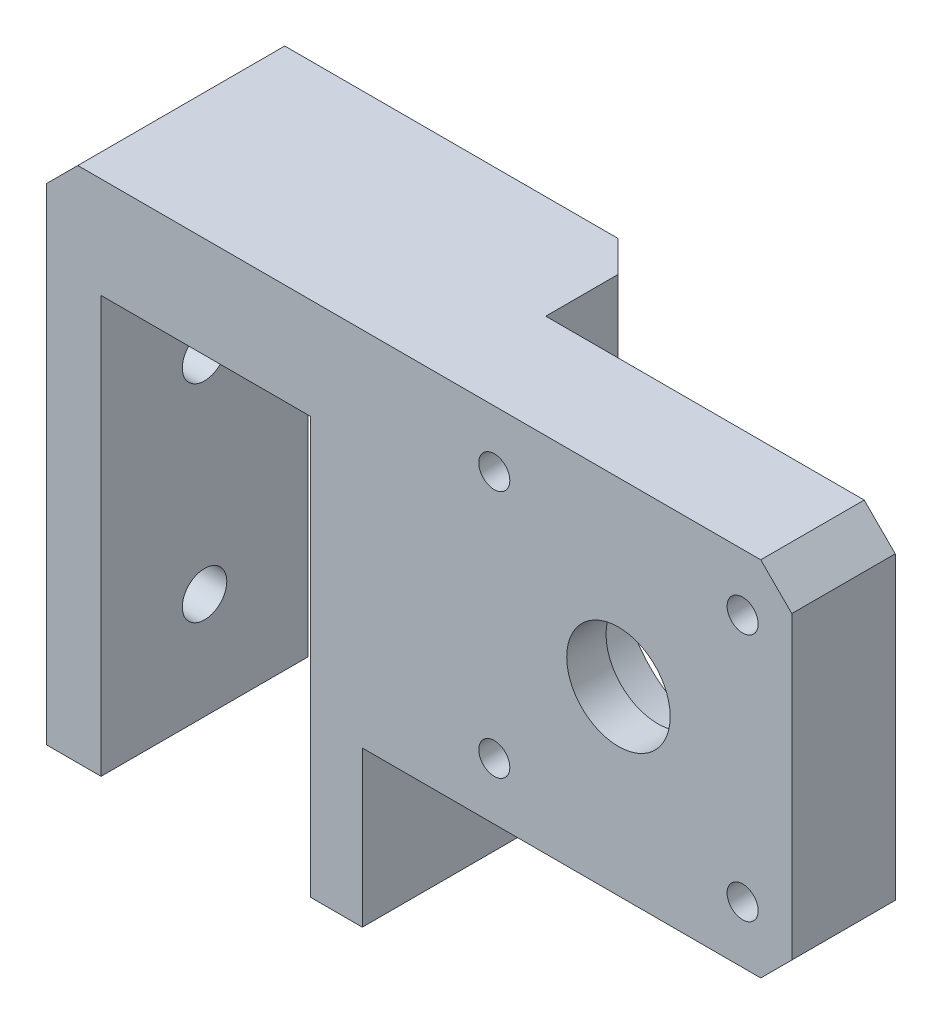
ISO-10303-21;
HEADER;
FILE_DESCRIPTION(('STEP AP214'),'2;1');
FILE_NAME('part.step','',(''),(''),'','','');
FILE_SCHEMA(('AUTOMOTIVE_DESIGN { 1 0 10303 214 1 1 1 1 }'));
ENDSEC;
DATA;
#1=APPLICATION_CONTEXT('core data for automotive mechanical design processes');
#2=APPLICATION_PROTOCOL_DEFINITION('international standard','automotive_design',2000,#1);
#3=PRODUCT_CONTEXT('',#1,'mechanical');
#4=PRODUCT('Part','Part','',(#3));
#5=PRODUCT_RELATED_PRODUCT_CATEGORY('part','',(#4));
#6=PRODUCT_DEFINITION_FORMATION('','',#4);
#7=PRODUCT_DEFINITION_CONTEXT('part definition',#1,'design');
#8=PRODUCT_DEFINITION('design','',#6,#7);
#9=PRODUCT_DEFINITION_SHAPE('','',#8);
#10=(LENGTH_UNIT() NAMED_UNIT(*) SI_UNIT(.MILLI.,.METRE.));
#11=(NAMED_UNIT(*) PLANE_ANGLE_UNIT() SI_UNIT($,.RADIAN.));
#12=(NAMED_UNIT(*) SI_UNIT($,.STERADIAN.) SOLID_ANGLE_UNIT());
#13=UNCERTAINTY_MEASURE_WITH_UNIT(LENGTH_MEASURE(1.E-05),#10,'distance_accuracy_value','');
#14=(GEOMETRIC_REPRESENTATION_CONTEXT(3) GLOBAL_UNCERTAINTY_ASSIGNED_CONTEXT((#13)) GLOBAL_UNIT_ASSIGNED_CONTEXT((#10,
#11,#12)) REPRESENTATION_CONTEXT('',''));
#15=CARTESIAN_POINT('',(0.,0.,0.));
#16=DIRECTION('',(0.,0.,1.));
#17=DIRECTION('',(1.,0.,0.));
#18=AXIS2_PLACEMENT_3D('',#15,#16,#17);
#19=CARTESIAN_POINT('',(55.25,32.5,20.));
#20=DIRECTION('',(0.,0.,-1.));
#21=DIRECTION('',(-1.,0.,0.));
#22=AXIS2_PLACEMENT_3D('',#19,#20,#21);
#23=CYLINDRICAL_SURFACE('',#22,5.);
#24=CARTESIAN_POINT('',(55.25,32.5,20.));
#25=DIRECTION('',(0.,0.,1.));
#26=DIRECTION('',(1.,0.,0.));
#27=AXIS2_PLACEMENT_3D('',#24,#25,#26);
#28=CIRCLE('',#27,5.);
#29=CARTESIAN_POINT('',(60.25,32.5,20.));
#30=VERTEX_POINT('',#29);
#31=EDGE_CURVE('E271',#30,#30,#28,.T.);
#32=ORIENTED_EDGE('',*,*,#31,.T.);
#33=EDGE_LOOP('',(#32));
#34=FACE_BOUND('',#33,.T.);
#35=CARTESIAN_POINT('',(55.25,32.5,16.2));
#36=DIRECTION('',(0.,0.,-1.));
#37=DIRECTION('',(-1.,0.,0.));
#38=AXIS2_PLACEMENT_3D('',#35,#36,#37);
#39=CIRCLE('',#38,5.);
#40=CARTESIAN_POINT('',(50.25,32.5,16.2));
#41=VERTEX_POINT('',#40);
#42=EDGE_CURVE('E200',#41,#41,#39,.T.);
#43=ORIENTED_EDGE('',*,*,#42,.T.);
#44=EDGE_LOOP('',(#43));
#45=FACE_BOUND('',#44,.T.);
#46=ADVANCED_FACE('F40',(#34,#45),#23,.F.);
#47=CARTESIAN_POINT('',(72.,50.,20.));
#48=DIRECTION('',(-1.,0.,0.));
#49=DIRECTION('',(0.,0.,1.));
#50=AXIS2_PLACEMENT_3D('',#47,#48,#49);
#51=PLANE('',#50);
#52=DIRECTION('',(0.,1.,0.));
#53=VECTOR('',#52,1.);
#54=CARTESIAN_POINT('',(72.,50.,20.));
#55=LINE('',#54,#53);
#56=CARTESIAN_POINT('',(72.,18.,20.));
#57=VERTEX_POINT('',#56);
#58=CARTESIAN_POINT('',(72.,47.,20.));
#59=VERTEX_POINT('',#58);
#60=EDGE_CURVE('E293',#57,#59,#55,.T.);
#61=ORIENTED_EDGE('',*,*,#60,.F.);
#62=DIRECTION('',(0.,0.,-1.));
#63=VECTOR('',#62,1.);
#64=CARTESIAN_POINT('',(72.,18.,20.));
#65=LINE('',#64,#63);
#66=CARTESIAN_POINT('',(72.,18.,9.99999999999998));
#67=VERTEX_POINT('',#66);
#68=EDGE_CURVE('E388',#57,#67,#65,.T.);
#69=ORIENTED_EDGE('',*,*,#68,.T.);
#70=DIRECTION('',(0.,-1.,0.));
#71=VECTOR('',#70,1.);
#72=CARTESIAN_POINT('',(72.,50.0000000000001,9.99999999999998));
#73=LINE('',#72,#71);
#74=CARTESIAN_POINT('',(72.,47.,9.99999999999998));
#75=VERTEX_POINT('',#74);
#76=EDGE_CURVE('E204',#75,#67,#73,.T.);
#77=ORIENTED_EDGE('',*,*,#76,.F.);
#78=DIRECTION('',(0.,0.,1.));
#79=VECTOR('',#78,1.);
#80=CARTESIAN_POINT('',(72.,47.,20.));
#81=LINE('',#80,#79);
#82=EDGE_CURVE('E385',#75,#59,#81,.T.);
#83=ORIENTED_EDGE('',*,*,#82,.T.);
#84=EDGE_LOOP('',(#61,#69,#77,#83));
#85=FACE_BOUND('',#84,.T.);
#86=ADVANCED_FACE('F402',(#85),#51,.F.);
#87=CARTESIAN_POINT('',(67.25,44.5,20.));
#88=DIRECTION('',(0.,0.,-1.));
#89=DIRECTION('',(-1.,0.,0.));
#90=AXIS2_PLACEMENT_3D('',#87,#88,#89);
#91=CYLINDRICAL_SURFACE('',#90,1.5);
#92=CARTESIAN_POINT('',(67.25,44.5,20.));
#93=DIRECTION('',(0.,0.,1.));
#94=DIRECTION('',(1.,0.,0.));
#95=AXIS2_PLACEMENT_3D('',#92,#93,#94);
#96=CIRCLE('',#95,1.5);
#97=CARTESIAN_POINT('',(68.75,44.5,20.));
#98=VERTEX_POINT('',#97);
#99=EDGE_CURVE('E267',#98,#98,#96,.T.);
#100=ORIENTED_EDGE('',*,*,#99,.T.);
#101=EDGE_LOOP('',(#100));
#102=FACE_BOUND('',#101,.T.);
#103=CARTESIAN_POINT('',(67.25,44.5,9.99999999999998));
#104=DIRECTION('',(0.,0.,-1.));
#105=DIRECTION('',(-1.,0.,0.));
#106=AXIS2_PLACEMENT_3D('',#103,#104,#105);
#107=CIRCLE('',#106,1.5);
#108=CARTESIAN_POINT('',(65.75,44.5,9.99999999999998));
#109=VERTEX_POINT('',#108);
#110=EDGE_CURVE('E235',#109,#109,#107,.T.);
#111=ORIENTED_EDGE('',*,*,#110,.T.);
#112=EDGE_LOOP('',(#111));
#113=FACE_BOUND('',#112,.T.);
#114=ADVANCED_FACE('F475',(#102,#113),#91,.F.);
#115=CARTESIAN_POINT('',(43.25,44.5,20.));
#116=DIRECTION('',(0.,0.,-1.));
#117=DIRECTION('',(-1.,0.,0.));
#118=AXIS2_PLACEMENT_3D('',#115,#116,#117);
#119=CYLINDRICAL_SURFACE('',#118,1.5);
#120=CARTESIAN_POINT('',(43.25,44.5,20.));
#121=DIRECTION('',(0.,0.,1.));
#122=DIRECTION('',(1.,0.,0.));
#123=AXIS2_PLACEMENT_3D('',#120,#121,#122);
#124=CIRCLE('',#123,1.5);
#125=CARTESIAN_POINT('',(44.75,44.5,20.));
#126=VERTEX_POINT('',#125);
#127=EDGE_CURVE('E263',#126,#126,#124,.T.);
#128=ORIENTED_EDGE('',*,*,#127,.T.);
#129=EDGE_LOOP('',(#128));
#130=FACE_BOUND('',#129,.T.);
#131=CARTESIAN_POINT('',(43.25,44.5,10.));
#132=DIRECTION('',(0.,0.,-1.));
#133=DIRECTION('',(-1.,0.,0.));
#134=AXIS2_PLACEMENT_3D('',#131,#132,#133);
#135=CIRCLE('',#134,1.5);
#136=CARTESIAN_POINT('',(41.75,44.5,10.));
#137=VERTEX_POINT('',#136);
#138=EDGE_CURVE('E231',#137,#137,#135,.T.);
#139=ORIENTED_EDGE('',*,*,#138,.T.);
#140=EDGE_LOOP('',(#139));
#141=FACE_BOUND('',#140,.T.);
#142=ADVANCED_FACE('F754',(#130,#141),#119,.F.);
#143=CARTESIAN_POINT('',(43.25,20.5,20.));
#144=DIRECTION('',(0.,0.,-1.));
#145=DIRECTION('',(-1.,0.,0.));
#146=AXIS2_PLACEMENT_3D('',#143,#144,#145);
#147=CYLINDRICAL_SURFACE('',#146,1.5);
#148=CARTESIAN_POINT('',(43.25,20.5,20.));
#149=DIRECTION('',(0.,0.,1.));
#150=DIRECTION('',(1.,0.,0.));
#151=AXIS2_PLACEMENT_3D('',#148,#149,#150);
#152=CIRCLE('',#151,1.5);
#153=CARTESIAN_POINT('',(44.75,20.5,20.));
#154=VERTEX_POINT('',#153);
#155=EDGE_CURVE('E259',#154,#154,#152,.T.);
#156=ORIENTED_EDGE('',*,*,#155,.T.);
#157=EDGE_LOOP('',(#156));
#158=FACE_BOUND('',#157,.T.);
#159=CARTESIAN_POINT('',(43.25,20.5,10.));
#160=DIRECTION('',(0.,0.,-1.));
#161=DIRECTION('',(-1.,0.,0.));
#162=AXIS2_PLACEMENT_3D('',#159,#160,#161);
#163=CIRCLE('',#162,1.5);
#164=CARTESIAN_POINT('',(41.75,20.5,10.));
#165=VERTEX_POINT('',#164);
#166=EDGE_CURVE('E227',#165,#165,#163,.T.);
#167=ORIENTED_EDGE('',*,*,#166,.T.);
#168=EDGE_LOOP('',(#167));
#169=FACE_BOUND('',#168,.T.);
#170=ADVANCED_FACE('F764',(#158,#169),#147,.F.);
#171=CARTESIAN_POINT('',(67.25,20.5,20.));
#172=DIRECTION('',(0.,0.,-1.));
#173=DIRECTION('',(-1.,0.,0.));
#174=AXIS2_PLACEMENT_3D('',#171,#172,#173);
#175=CYLINDRICAL_SURFACE('',#174,1.5);
#176=CARTESIAN_POINT('',(67.25,20.5,20.));
#177=DIRECTION('',(0.,0.,1.));
#178=DIRECTION('',(1.,0.,0.));
#179=AXIS2_PLACEMENT_3D('',#176,#177,#178);
#180=CIRCLE('',#179,1.5);
#181=CARTESIAN_POINT('',(68.75,20.5,20.));
#182=VERTEX_POINT('',#181);
#183=EDGE_CURVE('E252',#182,#182,#180,.T.);
#184=ORIENTED_EDGE('',*,*,#183,.T.);
#185=EDGE_LOOP('',(#184));
#186=FACE_BOUND('',#185,.T.);
#187=CARTESIAN_POINT('',(67.25,20.5,9.99999999999998));
#188=DIRECTION('',(0.,0.,-1.));
#189=DIRECTION('',(-1.,0.,0.));
#190=AXIS2_PLACEMENT_3D('',#187,#188,#189);
#191=CIRCLE('',#190,1.5);
#192=CARTESIAN_POINT('',(65.75,20.5,9.99999999999998));
#193=VERTEX_POINT('',#192);
#194=EDGE_CURVE('E223',#193,#193,#191,.T.);
#195=ORIENTED_EDGE('',*,*,#194,.T.);
#196=EDGE_LOOP('',(#195));
#197=FACE_BOUND('',#196,.T.);
#198=ADVANCED_FACE('F483',(#186,#197),#175,.F.);
#199=CARTESIAN_POINT('',(0.,0.,20.));
#200=DIRECTION('',(0.,0.,-1.));
#201=DIRECTION('',(-1.,0.,0.));
#202=AXIS2_PLACEMENT_3D('',#199,#200,#201);
#203=PLANE('',#202);
#204=DIRECTION('',(-1.,0.,0.));
#205=VECTOR('',#204,1.);
#206=CARTESIAN_POINT('',(25.5,40.25,20.));
#207=LINE('',#206,#205);
#208=CARTESIAN_POINT('',(25.5,40.25,20.));
#209=VERTEX_POINT('',#208);
#210=CARTESIAN_POINT('',(5.25000000000003,40.25,20.));
#211=VERTEX_POINT('',#210);
#212=EDGE_CURVE('E172',#209,#211,#207,.T.);
#213=ORIENTED_EDGE('',*,*,#212,.F.);
#214=DIRECTION('',(0.,-1.,0.));
#215=VECTOR('',#214,1.);
#216=CARTESIAN_POINT('',(25.5,40.5,20.));
#217=LINE('',#216,#215);
#218=CARTESIAN_POINT('',(25.5,0.,20.));
#219=VERTEX_POINT('',#218);
#220=EDGE_CURVE('E57',#209,#219,#217,.T.);
#221=ORIENTED_EDGE('',*,*,#220,.T.);
#222=DIRECTION('',(1.,0.,0.));
#223=VECTOR('',#222,1.);
#224=CARTESIAN_POINT('',(30.5,0.,20.));
#225=LINE('',#224,#223);
#226=CARTESIAN_POINT('',(30.5,0.,20.));
#227=VERTEX_POINT('',#226);
#228=EDGE_CURVE('E283',#219,#227,#225,.T.);
#229=ORIENTED_EDGE('',*,*,#228,.T.);
#230=DIRECTION('',(0.,1.,0.));
#231=VECTOR('',#230,1.);
#232=CARTESIAN_POINT('',(30.5,15.,20.));
#233=LINE('',#232,#231);
#234=CARTESIAN_POINT('',(30.5,15.,20.));
#235=VERTEX_POINT('',#234);
#236=EDGE_CURVE('E286',#227,#235,#233,.T.);
#237=ORIENTED_EDGE('',*,*,#236,.T.);
#238=DIRECTION('',(1.,0.,0.));
#239=VECTOR('',#238,1.);
#240=CARTESIAN_POINT('',(72.,15.,20.));
#241=LINE('',#240,#239);
#242=CARTESIAN_POINT('',(69.,15.,20.));
#243=VERTEX_POINT('',#242);
#244=EDGE_CURVE('E289',#235,#243,#241,.T.);
#245=ORIENTED_EDGE('',*,*,#244,.T.);
#246=DIRECTION('',(-0.707106781186548,-0.707106781186548,0.));
#247=VECTOR('',#246,1.);
#248=CARTESIAN_POINT('',(72.,18.,20.));
#249=LINE('',#248,#247);
#250=EDGE_CURVE('E369',#243,#57,#249,.F.);
#251=ORIENTED_EDGE('',*,*,#250,.T.);
#252=ORIENTED_EDGE('',*,*,#60,.T.);
#253=DIRECTION('',(0.707106781186546,-0.707106781186549,0.));
#254=VECTOR('',#253,1.);
#255=CARTESIAN_POINT('',(69.,50.,20.));
#256=LINE('',#255,#254);
#257=CARTESIAN_POINT('',(69.,50.,20.));
#258=VERTEX_POINT('',#257);
#259=EDGE_CURVE('E366',#59,#258,#256,.F.);
#260=ORIENTED_EDGE('',*,*,#259,.T.);
#261=DIRECTION('',(-1.,0.,0.));
#262=VECTOR('',#261,1.);
#263=CARTESIAN_POINT('',(0.,50.0000000000001,20.));
#264=LINE('',#263,#262);
#265=CARTESIAN_POINT('',(3.,50.,20.));
#266=VERTEX_POINT('',#265);
#267=EDGE_CURVE('E297',#258,#266,#264,.T.);
#268=ORIENTED_EDGE('',*,*,#267,.T.);
#269=DIRECTION('',(0.707106781186549,0.707106781186546,0.));
#270=VECTOR('',#269,1.);
#271=CARTESIAN_POINT('',(0.,47.0000000000001,20.));
#272=LINE('',#271,#270);
#273=CARTESIAN_POINT('',(0.,47.0000000000001,20.));
#274=VERTEX_POINT('',#273);
#275=EDGE_CURVE('E372',#266,#274,#272,.F.);
#276=ORIENTED_EDGE('',*,*,#275,.T.);
#277=DIRECTION('',(0.,-1.,0.));
#278=VECTOR('',#277,1.);
#279=CARTESIAN_POINT('',(0.,0.,20.));
#280=LINE('',#279,#278);
#281=CARTESIAN_POINT('',(0.,0.,20.));
#282=VERTEX_POINT('',#281);
#283=EDGE_CURVE('E301',#274,#282,#280,.T.);
#284=ORIENTED_EDGE('',*,*,#283,.T.);
#285=DIRECTION('',(1.,0.,0.));
#286=VECTOR('',#285,1.);
#287=CARTESIAN_POINT('',(5.,0.,20.));
#288=LINE('',#287,#286);
#289=CARTESIAN_POINT('',(5.24999999999998,0.,20.));
#290=VERTEX_POINT('',#289);
#291=EDGE_CURVE('E276',#282,#290,#288,.T.);
#292=ORIENTED_EDGE('',*,*,#291,.T.);
#293=DIRECTION('',(0.,-1.,0.));
#294=VECTOR('',#293,1.);
#295=CARTESIAN_POINT('',(5.24999999999998,40.5,20.));
#296=LINE('',#295,#294);
#297=EDGE_CURVE('E165',#211,#290,#296,.T.);
#298=ORIENTED_EDGE('',*,*,#297,.F.);
#299=EDGE_LOOP('',(#213,#221,#229,#237,#245,#251,#252,#260,#268,#276,#284,#292,#298));
#300=FACE_BOUND('',#299,.T.);
#301=ORIENTED_EDGE('',*,*,#31,.F.);
#302=EDGE_LOOP('',(#301));
#303=FACE_BOUND('',#302,.T.);
#304=ORIENTED_EDGE('',*,*,#99,.F.);
#305=EDGE_LOOP('',(#304));
#306=FACE_BOUND('',#305,.T.);
#307=ORIENTED_EDGE('',*,*,#127,.F.);
#308=EDGE_LOOP('',(#307));
#309=FACE_BOUND('',#308,.T.);
#310=ORIENTED_EDGE('',*,*,#155,.F.);
#311=EDGE_LOOP('',(#310));
#312=FACE_BOUND('',#311,.T.);
#313=ORIENTED_EDGE('',*,*,#183,.F.);
#314=EDGE_LOOP('',(#313));
#315=FACE_BOUND('',#314,.T.);
#316=ADVANCED_FACE('F407',(#300,#303,#306,#309,#312,#315),#203,.F.);
#317=CARTESIAN_POINT('',(0.,0.,0.));
#318=DIRECTION('',(0.,0.,-1.));
#319=DIRECTION('',(-1.,0.,0.));
#320=AXIS2_PLACEMENT_3D('',#317,#318,#319);
#321=PLANE('',#320);
#322=DIRECTION('',(0.,-1.,0.));
#323=VECTOR('',#322,1.);
#324=CARTESIAN_POINT('',(25.5,40.5,0.));
#325=LINE('',#324,#323);
#326=CARTESIAN_POINT('',(25.5,40.25,0.));
#327=VERTEX_POINT('',#326);
#328=CARTESIAN_POINT('',(25.5,0.,0.));
#329=VERTEX_POINT('',#328);
#330=EDGE_CURVE('E177',#327,#329,#325,.T.);
#331=ORIENTED_EDGE('',*,*,#330,.F.);
#332=DIRECTION('',(1.,0.,0.));
#333=VECTOR('',#332,1.);
#334=CARTESIAN_POINT('',(5.25000000000003,40.25,0.));
#335=LINE('',#334,#333);
#336=CARTESIAN_POINT('',(5.25000000000003,40.25,0.));
#337=VERTEX_POINT('',#336);
#338=EDGE_CURVE('E171',#337,#327,#335,.T.);
#339=ORIENTED_EDGE('',*,*,#338,.F.);
#340=DIRECTION('',(0.,1.,0.));
#341=VECTOR('',#340,1.);
#342=CARTESIAN_POINT('',(5.24999999999998,0.,0.));
#343=LINE('',#342,#341);
#344=CARTESIAN_POINT('',(5.24999999999998,0.,0.));
#345=VERTEX_POINT('',#344);
#346=EDGE_CURVE('E153',#345,#337,#343,.T.);
#347=ORIENTED_EDGE('',*,*,#346,.F.);
#348=DIRECTION('',(1.,0.,0.));
#349=VECTOR('',#348,1.);
#350=CARTESIAN_POINT('',(5.,0.,0.));
#351=LINE('',#350,#349);
#352=CARTESIAN_POINT('',(0.,0.,0.));
#353=VERTEX_POINT('',#352);
#354=EDGE_CURVE('E275',#353,#345,#351,.T.);
#355=ORIENTED_EDGE('',*,*,#354,.F.);
#356=DIRECTION('',(0.,-1.,0.));
#357=VECTOR('',#356,1.);
#358=CARTESIAN_POINT('',(0.,0.,0.));
#359=LINE('',#358,#357);
#360=CARTESIAN_POINT('',(0.,47.,0.));
#361=VERTEX_POINT('',#360);
#362=EDGE_CURVE('E280',#361,#353,#359,.T.);
#363=ORIENTED_EDGE('',*,*,#362,.F.);
#364=DIRECTION('',(-0.707106781186549,-0.707106781186546,0.));
#365=VECTOR('',#364,1.);
#366=CARTESIAN_POINT('',(-23.5,23.5000000000001,0.));
#367=LINE('',#366,#365);
#368=CARTESIAN_POINT('',(3.,50.,0.));
#369=VERTEX_POINT('',#368);
#370=EDGE_CURVE('E353',#361,#369,#367,.F.);
#371=ORIENTED_EDGE('',*,*,#370,.T.);
#372=DIRECTION('',(-1.,0.,0.));
#373=VECTOR('',#372,1.);
#374=CARTESIAN_POINT('',(0.,50.,0.));
#375=LINE('',#374,#373);
#376=CARTESIAN_POINT('',(35.2227335597847,50.,0.));
#377=VERTEX_POINT('',#376);
#378=EDGE_CURVE('E319',#377,#369,#375,.T.);
#379=ORIENTED_EDGE('',*,*,#378,.F.);
#380=DIRECTION('',(0.,-1.,0.));
#381=VECTOR('',#380,1.);
#382=CARTESIAN_POINT('',(35.2227335597847,15.,0.));
#383=LINE('',#382,#381);
#384=CARTESIAN_POINT('',(35.2227335597847,15.,0.));
#385=VERTEX_POINT('',#384);
#386=EDGE_CURVE('E350',#377,#385,#383,.T.);
#387=ORIENTED_EDGE('',*,*,#386,.T.);
#388=DIRECTION('',(1.,0.,0.));
#389=VECTOR('',#388,1.);
#390=CARTESIAN_POINT('',(72.,15.,0.));
#391=LINE('',#390,#389);
#392=CARTESIAN_POINT('',(30.5,15.,0.));
#393=VERTEX_POINT('',#392);
#394=EDGE_CURVE('E315',#393,#385,#391,.T.);
#395=ORIENTED_EDGE('',*,*,#394,.F.);
#396=DIRECTION('',(0.,1.,0.));
#397=VECTOR('',#396,1.);
#398=CARTESIAN_POINT('',(30.5,15.,0.));
#399=LINE('',#398,#397);
#400=CARTESIAN_POINT('',(30.5,0.,0.));
#401=VERTEX_POINT('',#400);
#402=EDGE_CURVE('E312',#401,#393,#399,.T.);
#403=ORIENTED_EDGE('',*,*,#402,.F.);
#404=DIRECTION('',(1.,0.,0.));
#405=VECTOR('',#404,1.);
#406=CARTESIAN_POINT('',(30.5,0.,0.));
#407=LINE('',#406,#405);
#408=EDGE_CURVE('E309',#329,#401,#407,.T.);
#409=ORIENTED_EDGE('',*,*,#408,.F.);
#410=EDGE_LOOP('',(#331,#339,#347,#355,#363,#371,#379,#387,#395,#403,#409));
#411=FACE_BOUND('',#410,.T.);
#412=ADVANCED_FACE('F175',(#411),#321,.T.);
#413=CARTESIAN_POINT('',(5.,0.,20.));
#414=DIRECTION('',(0.,1.,0.));
#415=DIRECTION('',(-1.,0.,0.));
#416=AXIS2_PLACEMENT_3D('',#413,#414,#415);
#417=PLANE('',#416);
#418=ORIENTED_EDGE('',*,*,#354,.T.);
#419=DIRECTION('',(0.,0.,-1.));
#420=VECTOR('',#419,1.);
#421=CARTESIAN_POINT('',(5.24999999999998,0.,20.));
#422=LINE('',#421,#420);
#423=EDGE_CURVE('E160',#290,#345,#422,.T.);
#424=ORIENTED_EDGE('',*,*,#423,.F.);
#425=ORIENTED_EDGE('',*,*,#291,.F.);
#426=DIRECTION('',(0.,0.,-1.));
#427=VECTOR('',#426,1.);
#428=CARTESIAN_POINT('',(0.,0.,20.));
#429=LINE('',#428,#427);
#430=EDGE_CURVE('E304',#282,#353,#429,.T.);
#431=ORIENTED_EDGE('',*,*,#430,.T.);
#432=EDGE_LOOP('',(#418,#424,#425,#431));
#433=FACE_BOUND('',#432,.T.);
#434=ADVANCED_FACE('F424',(#433),#417,.F.);
#435=CARTESIAN_POINT('',(25.5,40.5,20.));
#436=DIRECTION('',(1.,0.,0.));
#437=DIRECTION('',(0.,1.,0.));
#438=AXIS2_PLACEMENT_3D('',#435,#436,#437);
#439=PLANE('',#438);
#440=CARTESIAN_POINT('',(25.5,10.25,9.99999999999998));
#441=DIRECTION('',(1.,0.,0.));
#442=DIRECTION('',(0.,1.,0.));
#443=AXIS2_PLACEMENT_3D('',#440,#441,#442);
#444=CIRCLE('',#443,2.15000000000001);
#445=CARTESIAN_POINT('',(25.5,12.4,9.99999999999998));
#446=VERTEX_POINT('',#445);
#447=EDGE_CURVE('E243',#446,#446,#444,.T.);
#448=ORIENTED_EDGE('',*,*,#447,.T.);
#449=EDGE_LOOP('',(#448));
#450=FACE_BOUND('',#449,.T.);
#451=ORIENTED_EDGE('',*,*,#220,.F.);
#452=DIRECTION('',(0.,0.,1.));
#453=VECTOR('',#452,1.);
#454=CARTESIAN_POINT('',(25.5,40.25,0.));
#455=LINE('',#454,#453);
#456=EDGE_CURVE('E62',#327,#209,#455,.T.);
#457=ORIENTED_EDGE('',*,*,#456,.F.);
#458=ORIENTED_EDGE('',*,*,#330,.T.);
#459=DIRECTION('',(0.,0.,-1.));
#460=VECTOR('',#459,1.);
#461=CARTESIAN_POINT('',(25.5,0.,20.));
#462=LINE('',#461,#460);
#463=EDGE_CURVE('E336',#219,#329,#462,.T.);
#464=ORIENTED_EDGE('',*,*,#463,.F.);
#465=EDGE_LOOP('',(#451,#457,#458,#464));
#466=FACE_BOUND('',#465,.T.);
#467=ADVANCED_FACE('F433',(#450,#466),#439,.F.);
#468=CARTESIAN_POINT('',(30.5,0.,20.));
#469=DIRECTION('',(0.,1.,0.));
#470=DIRECTION('',(-1.,0.,0.));
#471=AXIS2_PLACEMENT_3D('',#468,#469,#470);
#472=PLANE('',#471);
#473=ORIENTED_EDGE('',*,*,#408,.T.);
#474=DIRECTION('',(0.,0.,-1.));
#475=VECTOR('',#474,1.);
#476=CARTESIAN_POINT('',(30.5,0.,20.));
#477=LINE('',#476,#475);
#478=EDGE_CURVE('E332',#227,#401,#477,.T.);
#479=ORIENTED_EDGE('',*,*,#478,.F.);
#480=ORIENTED_EDGE('',*,*,#228,.F.);
#481=ORIENTED_EDGE('',*,*,#463,.T.);
#482=EDGE_LOOP('',(#473,#479,#480,#481));
#483=FACE_BOUND('',#482,.T.);
#484=ADVANCED_FACE('F435',(#483),#472,.F.);
#485=CARTESIAN_POINT('',(30.5,15.,20.));
#486=DIRECTION('',(-1.,0.,0.));
#487=DIRECTION('',(0.,-1.,0.));
#488=AXIS2_PLACEMENT_3D('',#485,#486,#487);
#489=PLANE('',#488);
#490=CARTESIAN_POINT('',(30.5,10.25,9.99999999999998));
#491=DIRECTION('',(1.,0.,0.));
#492=DIRECTION('',(0.,1.,0.));
#493=AXIS2_PLACEMENT_3D('',#490,#491,#492);
#494=CIRCLE('',#493,2.15000000000001);
#495=CARTESIAN_POINT('',(30.5,12.4,9.99999999999998));
#496=VERTEX_POINT('',#495);
#497=EDGE_CURVE('E239',#496,#496,#494,.T.);
#498=ORIENTED_EDGE('',*,*,#497,.F.);
#499=EDGE_LOOP('',(#498));
#500=FACE_BOUND('',#499,.T.);
#501=ORIENTED_EDGE('',*,*,#402,.T.);
#502=DIRECTION('',(0.,0.,-1.));
#503=VECTOR('',#502,1.);
#504=CARTESIAN_POINT('',(30.5,15.,20.));
#505=LINE('',#504,#503);
#506=EDGE_CURVE('E328',#235,#393,#505,.T.);
#507=ORIENTED_EDGE('',*,*,#506,.F.);
#508=ORIENTED_EDGE('',*,*,#236,.F.);
#509=ORIENTED_EDGE('',*,*,#478,.T.);
#510=EDGE_LOOP('',(#501,#507,#508,#509));
#511=FACE_BOUND('',#510,.T.);
#512=ADVANCED_FACE('F440',(#500,#511),#489,.F.);
#513=CARTESIAN_POINT('',(72.,15.,20.));
#514=DIRECTION('',(0.,1.,0.));
#515=DIRECTION('',(-1.,0.,0.));
#516=AXIS2_PLACEMENT_3D('',#513,#514,#515);
#517=PLANE('',#516);
#518=ORIENTED_EDGE('',*,*,#394,.T.);
#519=DIRECTION('',(0.707106781186548,0.,0.707106781186548));
#520=VECTOR('',#519,1.);
#521=CARTESIAN_POINT('',(38.2227335597847,15.,3.));
#522=LINE('',#521,#520);
#523=CARTESIAN_POINT('',(38.2227335597847,15.,3.));
#524=VERTEX_POINT('',#523);
#525=EDGE_CURVE('E382',#385,#524,#522,.T.);
#526=ORIENTED_EDGE('',*,*,#525,.T.);
#527=DIRECTION('',(0.,0.,-1.));
#528=VECTOR('',#527,1.);
#529=CARTESIAN_POINT('',(38.2227335597847,15.,9.99999999999998));
#530=LINE('',#529,#528);
#531=CARTESIAN_POINT('',(38.2227335597847,15.,9.99999999999998));
#532=VERTEX_POINT('',#531);
#533=EDGE_CURVE('E218',#532,#524,#530,.T.);
#534=ORIENTED_EDGE('',*,*,#533,.F.);
#535=DIRECTION('',(-1.,0.,0.));
#536=VECTOR('',#535,1.);
#537=CARTESIAN_POINT('',(72.,15.,10.));
#538=LINE('',#537,#536);
#539=CARTESIAN_POINT('',(69.,15.,9.99999999999998));
#540=VERTEX_POINT('',#539);
#541=EDGE_CURVE('E208',#540,#532,#538,.T.);
#542=ORIENTED_EDGE('',*,*,#541,.F.);
#543=DIRECTION('',(0.,0.,1.));
#544=VECTOR('',#543,1.);
#545=CARTESIAN_POINT('',(69.,15.,20.));
#546=LINE('',#545,#544);
#547=EDGE_CURVE('E379',#540,#243,#546,.T.);
#548=ORIENTED_EDGE('',*,*,#547,.T.);
#549=ORIENTED_EDGE('',*,*,#244,.F.);
#550=ORIENTED_EDGE('',*,*,#506,.T.);
#551=EDGE_LOOP('',(#518,#526,#534,#542,#548,#549,#550));
#552=FACE_BOUND('',#551,.T.);
#553=ADVANCED_FACE('F450',(#552),#517,.F.);
#554=CARTESIAN_POINT('',(0.,50.0000000000001,20.));
#555=DIRECTION('',(0.,-1.,0.));
#556=DIRECTION('',(0.,0.,-1.));
#557=AXIS2_PLACEMENT_3D('',#554,#555,#556);
#558=PLANE('',#557);
#559=ORIENTED_EDGE('',*,*,#378,.T.);
#560=DIRECTION('',(0.,0.,1.));
#561=VECTOR('',#560,1.);
#562=CARTESIAN_POINT('',(3.,50.,20.));
#563=LINE('',#562,#561);
#564=EDGE_CURVE('E363',#369,#266,#563,.T.);
#565=ORIENTED_EDGE('',*,*,#564,.T.);
#566=ORIENTED_EDGE('',*,*,#267,.F.);
#567=DIRECTION('',(0.,0.,-1.));
#568=VECTOR('',#567,1.);
#569=CARTESIAN_POINT('',(69.,50.,20.));
#570=LINE('',#569,#568);
#571=CARTESIAN_POINT('',(69.,50.,9.99999999999998));
#572=VERTEX_POINT('',#571);
#573=EDGE_CURVE('E356',#258,#572,#570,.T.);
#574=ORIENTED_EDGE('',*,*,#573,.T.);
#575=DIRECTION('',(1.,0.,0.));
#576=VECTOR('',#575,1.);
#577=CARTESIAN_POINT('',(72.,50.0000000000001,9.99999999999998));
#578=LINE('',#577,#576);
#579=CARTESIAN_POINT('',(38.2227335597847,50.,9.99999999999998));
#580=VERTEX_POINT('',#579);
#581=EDGE_CURVE('E214',#580,#572,#578,.T.);
#582=ORIENTED_EDGE('',*,*,#581,.F.);
#583=DIRECTION('',(0.,0.,-1.));
#584=VECTOR('',#583,1.);
#585=CARTESIAN_POINT('',(38.2227335597847,50.,9.99999999999998));
#586=LINE('',#585,#584);
#587=CARTESIAN_POINT('',(38.2227335597847,50.,3.));
#588=VERTEX_POINT('',#587);
#589=EDGE_CURVE('E219',#580,#588,#586,.T.);
#590=ORIENTED_EDGE('',*,*,#589,.T.);
#591=DIRECTION('',(-0.707106781186548,0.,-0.707106781186548));
#592=VECTOR('',#591,1.);
#593=CARTESIAN_POINT('',(38.2227335597847,50.,3.));
#594=LINE('',#593,#592);
#595=EDGE_CURVE('E360',#588,#377,#594,.T.);
#596=ORIENTED_EDGE('',*,*,#595,.T.);
#597=EDGE_LOOP('',(#559,#565,#566,#574,#582,#590,#596));
#598=FACE_BOUND('',#597,.T.);
#599=ADVANCED_FACE('F411',(#598),#558,.F.);
#600=CARTESIAN_POINT('',(0.,0.,20.));
#601=DIRECTION('',(1.,0.,0.));
#602=DIRECTION('',(0.,0.,-1.));
#603=AXIS2_PLACEMENT_3D('',#600,#601,#602);
#604=PLANE('',#603);
#605=CARTESIAN_POINT('',(0.,10.25,9.99999999999998));
#606=DIRECTION('',(-1.,0.,0.));
#607=DIRECTION('',(0.,0.,1.));
#608=AXIS2_PLACEMENT_3D('',#605,#606,#607);
#609=CIRCLE('',#608,2.15);
#610=CARTESIAN_POINT('',(0.,10.25,12.15));
#611=VERTEX_POINT('',#610);
#612=EDGE_CURVE('E248',#611,#611,#609,.T.);
#613=ORIENTED_EDGE('',*,*,#612,.F.);
#614=EDGE_LOOP('',(#613));
#615=FACE_BOUND('',#614,.T.);
#616=CARTESIAN_POINT('',(0.,30.2500000000001,10.));
#617=DIRECTION('',(-1.,0.,0.));
#618=DIRECTION('',(0.,0.,1.));
#619=AXIS2_PLACEMENT_3D('',#616,#617,#618);
#620=CIRCLE('',#619,2.15);
#621=CARTESIAN_POINT('',(0.,30.2500000000001,12.15));
#622=VERTEX_POINT('',#621);
#623=EDGE_CURVE('E247',#622,#622,#620,.T.);
#624=ORIENTED_EDGE('',*,*,#623,.F.);
#625=EDGE_LOOP('',(#624));
#626=FACE_BOUND('',#625,.T.);
#627=ORIENTED_EDGE('',*,*,#283,.F.);
#628=DIRECTION('',(0.,0.,-1.));
#629=VECTOR('',#628,1.);
#630=CARTESIAN_POINT('',(0.,47.0000000000001,20.));
#631=LINE('',#630,#629);
#632=EDGE_CURVE('E340',#274,#361,#631,.T.);
#633=ORIENTED_EDGE('',*,*,#632,.T.);
#634=ORIENTED_EDGE('',*,*,#362,.T.);
#635=ORIENTED_EDGE('',*,*,#430,.F.);
#636=EDGE_LOOP('',(#627,#633,#634,#635));
#637=FACE_BOUND('',#636,.T.);
#638=ADVANCED_FACE('F420',(#615,#626,#637),#604,.F.);
#639=CARTESIAN_POINT('',(20.,30.25,9.99999999999998));
#640=DIRECTION('',(-1.,0.,0.));
#641=DIRECTION('',(0.,0.,1.));
#642=AXIS2_PLACEMENT_3D('',#639,#640,#641);
#643=CYLINDRICAL_SURFACE('',#642,2.15);
#644=ORIENTED_EDGE('',*,*,#623,.T.);
#645=EDGE_LOOP('',(#644));
#646=FACE_BOUND('',#645,.T.);
#647=CARTESIAN_POINT('',(5.24999999999998,30.25,9.99999999999998));
#648=DIRECTION('',(1.,0.,0.));
#649=DIRECTION('',(0.,0.,-1.));
#650=AXIS2_PLACEMENT_3D('',#647,#648,#649);
#651=CIRCLE('',#650,2.15);
#652=CARTESIAN_POINT('',(5.24999999999998,30.25,7.84999999999998));
#653=VERTEX_POINT('',#652);
#654=EDGE_CURVE('E179',#653,#653,#651,.T.);
#655=ORIENTED_EDGE('',*,*,#654,.T.);
#656=EDGE_LOOP('',(#655));
#657=FACE_BOUND('',#656,.T.);
#658=ADVANCED_FACE('F488',(#646,#657),#643,.F.);
#659=CARTESIAN_POINT('',(20.,10.25,10.));
#660=DIRECTION('',(-1.,0.,0.));
#661=DIRECTION('',(0.,0.,1.));
#662=AXIS2_PLACEMENT_3D('',#659,#660,#661);
#663=CYLINDRICAL_SURFACE('',#662,2.15);
#664=ORIENTED_EDGE('',*,*,#612,.T.);
#665=EDGE_LOOP('',(#664));
#666=FACE_BOUND('',#665,.T.);
#667=CARTESIAN_POINT('',(5.24999999999998,10.25,10.));
#668=DIRECTION('',(1.,0.,0.));
#669=DIRECTION('',(0.,0.,-1.));
#670=AXIS2_PLACEMENT_3D('',#667,#668,#669);
#671=CIRCLE('',#670,2.15);
#672=CARTESIAN_POINT('',(5.24999999999998,10.25,7.85000000000001));
#673=VERTEX_POINT('',#672);
#674=EDGE_CURVE('E184',#673,#673,#671,.T.);
#675=ORIENTED_EDGE('',*,*,#674,.T.);
#676=EDGE_LOOP('',(#675));
#677=FACE_BOUND('',#676,.T.);
#678=ADVANCED_FACE('F547',(#666,#677),#663,.F.);
#679=CARTESIAN_POINT('',(10.5,10.2500000000001,9.99999999999998));
#680=DIRECTION('',(1.,0.,0.));
#681=DIRECTION('',(0.,1.,0.));
#682=AXIS2_PLACEMENT_3D('',#679,#680,#681);
#683=CYLINDRICAL_SURFACE('',#682,2.15000000000001);
#684=ORIENTED_EDGE('',*,*,#497,.T.);
#685=EDGE_LOOP('',(#684));
#686=FACE_BOUND('',#685,.T.);
#687=ORIENTED_EDGE('',*,*,#447,.F.);
#688=EDGE_LOOP('',(#687));
#689=FACE_BOUND('',#688,.T.);
#690=ADVANCED_FACE('F555',(#686,#689),#683,.F.);
#691=CARTESIAN_POINT('',(38.2227335597847,50.,9.99999999999998));
#692=DIRECTION('',(-1.,0.,0.));
#693=DIRECTION('',(0.,0.,1.));
#694=AXIS2_PLACEMENT_3D('',#691,#692,#693);
#695=PLANE('',#694);
#696=ORIENTED_EDGE('',*,*,#533,.T.);
#697=DIRECTION('',(0.,1.,0.));
#698=VECTOR('',#697,1.);
#699=CARTESIAN_POINT('',(38.2227335597847,50.,3.));
#700=LINE('',#699,#698);
#701=EDGE_CURVE('E375',#524,#588,#700,.T.);
#702=ORIENTED_EDGE('',*,*,#701,.T.);
#703=ORIENTED_EDGE('',*,*,#589,.F.);
#704=DIRECTION('',(0.,1.,0.));
#705=VECTOR('',#704,1.);
#706=CARTESIAN_POINT('',(38.2227335597847,50.,9.99999999999998));
#707=LINE('',#706,#705);
#708=EDGE_CURVE('E211',#532,#580,#707,.T.);
#709=ORIENTED_EDGE('',*,*,#708,.F.);
#710=EDGE_LOOP('',(#696,#702,#703,#709));
#711=FACE_BOUND('',#710,.T.);
#712=ADVANCED_FACE('F454',(#711),#695,.F.);
#713=CARTESIAN_POINT('',(0.,0.,10.));
#714=DIRECTION('',(0.,0.,-1.));
#715=DIRECTION('',(-1.,0.,0.));
#716=AXIS2_PLACEMENT_3D('',#713,#714,#715);
#717=PLANE('',#716);
#718=CARTESIAN_POINT('',(55.25,32.5000000000001,9.99999999999998));
#719=DIRECTION('',(0.,0.,-1.));
#720=DIRECTION('',(-1.,0.,0.));
#721=AXIS2_PLACEMENT_3D('',#718,#719,#720);
#722=CIRCLE('',#721,9.75);
#723=CARTESIAN_POINT('',(45.5,32.5,9.99999999999998));
#724=VERTEX_POINT('',#723);
#725=EDGE_CURVE('E195',#724,#724,#722,.T.);
#726=ORIENTED_EDGE('',*,*,#725,.F.);
#727=EDGE_LOOP('',(#726));
#728=FACE_BOUND('',#727,.T.);
#729=ORIENTED_EDGE('',*,*,#110,.F.);
#730=EDGE_LOOP('',(#729));
#731=FACE_BOUND('',#730,.T.);
#732=ORIENTED_EDGE('',*,*,#138,.F.);
#733=EDGE_LOOP('',(#732));
#734=FACE_BOUND('',#733,.T.);
#735=ORIENTED_EDGE('',*,*,#166,.F.);
#736=EDGE_LOOP('',(#735));
#737=FACE_BOUND('',#736,.T.);
#738=ORIENTED_EDGE('',*,*,#194,.F.);
#739=EDGE_LOOP('',(#738));
#740=FACE_BOUND('',#739,.T.);
#741=ORIENTED_EDGE('',*,*,#76,.T.);
#742=DIRECTION('',(0.707106781186548,0.707106781186548,0.));
#743=VECTOR('',#742,1.);
#744=CARTESIAN_POINT('',(27.,-27.,10.));
#745=LINE('',#744,#743);
#746=EDGE_CURVE('E11',#67,#540,#745,.F.);
#747=ORIENTED_EDGE('',*,*,#746,.T.);
#748=ORIENTED_EDGE('',*,*,#541,.T.);
#749=ORIENTED_EDGE('',*,*,#708,.T.);
#750=ORIENTED_EDGE('',*,*,#581,.T.);
#751=DIRECTION('',(-0.707106781186546,0.707106781186549,0.));
#752=VECTOR('',#751,1.);
#753=CARTESIAN_POINT('',(59.5000000000001,59.4999999999999,10.));
#754=LINE('',#753,#752);
#755=EDGE_CURVE('E50',#572,#75,#754,.F.);
#756=ORIENTED_EDGE('',*,*,#755,.T.);
#757=EDGE_LOOP('',(#741,#747,#748,#749,#750,#756));
#758=FACE_BOUND('',#757,.T.);
#759=ADVANCED_FACE('F395',(#728,#731,#734,#737,#740,#758),#717,.T.);
#760=CARTESIAN_POINT('',(55.25,32.5,16.2));
#761=DIRECTION('',(0.,0.,-1.));
#762=DIRECTION('',(-1.,0.,0.));
#763=AXIS2_PLACEMENT_3D('',#760,#761,#762);
#764=CYLINDRICAL_SURFACE('',#763,9.75);
#765=CARTESIAN_POINT('',(55.25,32.5,16.2));
#766=DIRECTION('',(0.,0.,-1.));
#767=DIRECTION('',(-1.,0.,0.));
#768=AXIS2_PLACEMENT_3D('',#765,#766,#767);
#769=CIRCLE('',#768,9.75);
#770=CARTESIAN_POINT('',(45.5,32.5,16.2));
#771=VERTEX_POINT('',#770);
#772=EDGE_CURVE('E196',#771,#771,#769,.T.);
#773=CARTESIAN_POINT('',(45.5,32.5,16.2));
#774=CARTESIAN_POINT('',(45.5,32.5,16.1354166666667));
#775=CARTESIAN_POINT('',(45.5,32.5,16.0708333333333));
#776=CARTESIAN_POINT('',(45.5,32.5,15.9416666666667));
#777=CARTESIAN_POINT('',(45.5,32.5,15.8770833333333));
#778=CARTESIAN_POINT('',(45.5,32.5,15.7479166666667));
#779=CARTESIAN_POINT('',(45.5,32.5,15.6833333333333));
#780=CARTESIAN_POINT('',(45.5,32.5,15.5541666666667));
#781=CARTESIAN_POINT('',(45.5,32.5,15.4895833333333));
#782=CARTESIAN_POINT('',(45.5,32.5,15.3604166666667));
#783=CARTESIAN_POINT('',(45.5,32.5,15.2958333333333));
#784=CARTESIAN_POINT('',(45.5,32.5,15.1666666666667));
#785=CARTESIAN_POINT('',(45.5,32.5,15.1020833333333));
#786=CARTESIAN_POINT('',(45.5,32.5,14.9729166666667));
#787=CARTESIAN_POINT('',(45.5,32.5,14.9083333333333));
#788=CARTESIAN_POINT('',(45.5,32.5,14.7791666666667));
#789=CARTESIAN_POINT('',(45.5,32.5,14.7145833333333));
#790=CARTESIAN_POINT('',(45.5,32.5,14.5854166666667));
#791=CARTESIAN_POINT('',(45.5,32.5,14.5208333333333));
#792=CARTESIAN_POINT('',(45.5,32.5,14.3916666666667));
#793=CARTESIAN_POINT('',(45.5,32.5,14.3270833333333));
#794=CARTESIAN_POINT('',(45.5,32.5,14.1979166666667));
#795=CARTESIAN_POINT('',(45.5,32.5,14.1333333333333));
#796=CARTESIAN_POINT('',(45.5,32.5,14.0041666666667));
#797=CARTESIAN_POINT('',(45.5,32.5,13.9395833333333));
#798=CARTESIAN_POINT('',(45.5,32.5,13.8104166666667));
#799=CARTESIAN_POINT('',(45.5,32.5,13.7458333333333));
#800=CARTESIAN_POINT('',(45.5,32.5,13.6166666666667));
#801=CARTESIAN_POINT('',(45.5,32.5,13.5520833333333));
#802=CARTESIAN_POINT('',(45.5,32.5,13.4229166666667));
#803=CARTESIAN_POINT('',(45.5,32.5,13.3583333333333));
#804=CARTESIAN_POINT('',(45.5,32.5,13.2291666666667));
#805=CARTESIAN_POINT('',(45.5,32.5,13.1645833333333));
#806=CARTESIAN_POINT('',(45.5,32.5,13.0354166666667));
#807=CARTESIAN_POINT('',(45.5,32.5,12.9708333333333));
#808=CARTESIAN_POINT('',(45.5,32.5,12.8416666666667));
#809=CARTESIAN_POINT('',(45.5,32.5,12.7770833333333));
#810=CARTESIAN_POINT('',(45.5,32.5,12.6479166666667));
#811=CARTESIAN_POINT('',(45.5,32.5,12.5833333333333));
#812=CARTESIAN_POINT('',(45.5,32.5,12.4541666666667));
#813=CARTESIAN_POINT('',(45.5,32.5,12.3895833333333));
#814=CARTESIAN_POINT('',(45.5,32.5,12.2604166666667));
#815=CARTESIAN_POINT('',(45.5,32.5,12.1958333333333));
#816=CARTESIAN_POINT('',(45.5,32.5,12.0666666666667));
#817=CARTESIAN_POINT('',(45.5,32.5,12.0020833333333));
#818=CARTESIAN_POINT('',(45.5,32.5,11.8729166666666));
#819=CARTESIAN_POINT('',(45.5,32.5,11.8083333333333));
#820=CARTESIAN_POINT('',(45.5,32.5,11.6791666666666));
#821=CARTESIAN_POINT('',(45.5,32.5,11.6145833333333));
#822=CARTESIAN_POINT('',(45.5,32.5,11.4854166666667));
#823=CARTESIAN_POINT('',(45.5,32.5,11.4208333333333));
#824=CARTESIAN_POINT('',(45.5,32.5,11.2916666666667));
#825=CARTESIAN_POINT('',(45.5,32.5,11.2270833333333));
#826=CARTESIAN_POINT('',(45.5,32.5,11.0979166666666));
#827=CARTESIAN_POINT('',(45.5,32.5,11.0333333333333));
#828=CARTESIAN_POINT('',(45.5,32.5,10.9041666666666));
#829=CARTESIAN_POINT('',(45.5,32.5,10.8395833333333));
#830=CARTESIAN_POINT('',(45.5,32.5,10.7104166666666));
#831=CARTESIAN_POINT('',(45.5,32.5,10.6458333333333));
#832=CARTESIAN_POINT('',(45.5,32.5,10.5166666666666));
#833=CARTESIAN_POINT('',(45.5,32.5,10.4520833333333));
#834=CARTESIAN_POINT('',(45.5,32.5,10.3229166666666));
#835=CARTESIAN_POINT('',(45.5,32.5,10.2583333333333));
#836=CARTESIAN_POINT('',(45.5,32.5,10.1291666666666));
#837=CARTESIAN_POINT('',(45.5,32.5,10.0645833333333));
#838=CARTESIAN_POINT('',(45.5,32.5,9.99999999999998));
#839=B_SPLINE_CURVE_WITH_KNOTS('',3,(#773,#774,#775,#776,#777,#778,#779,#780,#781,#782,#783,
#784,#785,#786,#787,#788,#789,#790,#791,#792,#793,#794,#795,#796,#797,#798,#799,#800,#801,#802,
#803,#804,#805,#806,#807,#808,#809,#810,#811,#812,#813,#814,#815,#816,#817,#818,#819,#820,#821,
#822,#823,#824,#825,#826,#827,#828,#829,#830,#831,#832,#833,#834,#835,#836,#837,#838),
.UNSPECIFIED.,.F.,.F.,(4,2,2,2,2,2,2,2,2,2,2,2,2,2,2,2,2,2,2,2,2,2,2,2,2,2,2,2,2,2,2,2,4),(0.,
0.193750000000003,0.387500000000002,0.581250000000002,0.775000000000003,0.968750000000003,
1.1625,1.35625,1.55,1.74375,1.93750000000001,2.13125,2.32500000000001,2.51875000000001,
2.71250000000001,2.90625000000001,3.10000000000001,3.29375000000001,3.48750000000001,
3.68125000000001,3.87500000000001,4.06875000000001,4.26250000000001,4.45625000000001,
4.65000000000001,4.84375000000001,5.03750000000001,5.23125000000001,5.42500000000001,
5.61875000000001,5.81250000000001,6.00625000000001,6.20000000000001),.UNSPECIFIED.);
#840=EDGE_CURVE('BSEAM576',#771,#724,#839,.T.);
#841=ORIENTED_EDGE('',*,*,#772,.F.);
#842=ORIENTED_EDGE('',*,*,#725,.T.);
#843=ORIENTED_EDGE('',*,*,#840,.T.);
#844=ORIENTED_EDGE('',*,*,#840,.F.);
#845=EDGE_LOOP('',(#841,#843,#842,#844));
#846=FACE_BOUND('',#845,.T.);
#847=ADVANCED_FACE('F576',(#846),#764,.F.);
#848=CARTESIAN_POINT('',(55.25,32.5,16.2));
#849=DIRECTION('',(0.,0.,-1.));
#850=DIRECTION('',(-1.,0.,0.));
#851=AXIS2_PLACEMENT_3D('',#848,#849,#850);
#852=PLANE('',#851);
#853=ORIENTED_EDGE('',*,*,#42,.F.);
#854=EDGE_LOOP('',(#853));
#855=FACE_BOUND('',#854,.T.);
#856=ORIENTED_EDGE('',*,*,#772,.T.);
#857=EDGE_LOOP('',(#856));
#858=FACE_BOUND('',#857,.T.);
#859=ADVANCED_FACE('F466',(#855,#858),#852,.T.);
#860=CARTESIAN_POINT('',(0.,47.0000000000001,20.));
#861=DIRECTION('',(0.707106781186546,-0.707106781186549,0.));
#862=DIRECTION('',(0.,0.,-1.));
#863=AXIS2_PLACEMENT_3D('',#860,#861,#862);
#864=PLANE('',#863);
#865=ORIENTED_EDGE('',*,*,#275,.F.);
#866=ORIENTED_EDGE('',*,*,#564,.F.);
#867=ORIENTED_EDGE('',*,*,#370,.F.);
#868=ORIENTED_EDGE('',*,*,#632,.F.);
#869=EDGE_LOOP('',(#865,#866,#867,#868));
#870=FACE_BOUND('',#869,.T.);
#871=ADVANCED_FACE('F415',(#870),#864,.F.);
#872=CARTESIAN_POINT('',(38.2227335597847,50.,3.));
#873=DIRECTION('',(0.707106781186548,0.,-0.707106781186548));
#874=DIRECTION('',(0.,-1.,0.));
#875=AXIS2_PLACEMENT_3D('',#872,#873,#874);
#876=PLANE('',#875);
#877=ORIENTED_EDGE('',*,*,#525,.F.);
#878=ORIENTED_EDGE('',*,*,#386,.F.);
#879=ORIENTED_EDGE('',*,*,#595,.F.);
#880=ORIENTED_EDGE('',*,*,#701,.F.);
#881=EDGE_LOOP('',(#877,#878,#879,#880));
#882=FACE_BOUND('',#881,.T.);
#883=ADVANCED_FACE('F457',(#882),#876,.T.);
#884=CARTESIAN_POINT('',(72.,18.,20.));
#885=DIRECTION('',(-0.707106781186548,0.707106781186548,0.));
#886=DIRECTION('',(0.,0.,-1.));
#887=AXIS2_PLACEMENT_3D('',#884,#885,#886);
#888=PLANE('',#887);
#889=ORIENTED_EDGE('',*,*,#250,.F.);
#890=ORIENTED_EDGE('',*,*,#547,.F.);
#891=ORIENTED_EDGE('',*,*,#746,.F.);
#892=ORIENTED_EDGE('',*,*,#68,.F.);
#893=EDGE_LOOP('',(#889,#890,#891,#892));
#894=FACE_BOUND('',#893,.T.);
#895=ADVANCED_FACE('F446',(#894),#888,.F.);
#896=CARTESIAN_POINT('',(69.,50.,20.));
#897=DIRECTION('',(-0.707106781186549,-0.707106781186546,0.));
#898=DIRECTION('',(0.,0.,-1.));
#899=AXIS2_PLACEMENT_3D('',#896,#897,#898);
#900=PLANE('',#899);
#901=ORIENTED_EDGE('',*,*,#259,.F.);
#902=ORIENTED_EDGE('',*,*,#82,.F.);
#903=ORIENTED_EDGE('',*,*,#755,.F.);
#904=ORIENTED_EDGE('',*,*,#573,.F.);
#905=EDGE_LOOP('',(#901,#902,#903,#904));
#906=FACE_BOUND('',#905,.T.);
#907=ADVANCED_FACE('F43',(#906),#900,.F.);
#908=CARTESIAN_POINT('',(5.24999999999998,0.,0.));
#909=DIRECTION('',(1.,0.,0.));
#910=DIRECTION('',(0.,0.,-1.));
#911=AXIS2_PLACEMENT_3D('',#908,#909,#910);
#912=PLANE('',#911);
#913=DIRECTION('',(0.,0.,-1.));
#914=VECTOR('',#913,1.);
#915=CARTESIAN_POINT('',(5.25000000000003,40.25,20.));
#916=LINE('',#915,#914);
#917=EDGE_CURVE('E157',#211,#337,#916,.T.);
#918=ORIENTED_EDGE('',*,*,#917,.F.);
#919=ORIENTED_EDGE('',*,*,#297,.T.);
#920=ORIENTED_EDGE('',*,*,#423,.T.);
#921=ORIENTED_EDGE('',*,*,#346,.T.);
#922=EDGE_LOOP('',(#918,#919,#920,#921));
#923=FACE_BOUND('',#922,.T.);
#924=ORIENTED_EDGE('',*,*,#674,.F.);
#925=EDGE_LOOP('',(#924));
#926=FACE_BOUND('',#925,.T.);
#927=ORIENTED_EDGE('',*,*,#654,.F.);
#928=EDGE_LOOP('',(#927));
#929=FACE_BOUND('',#928,.T.);
#930=ADVANCED_FACE('F155',(#923,#926,#929),#912,.T.);
#931=CARTESIAN_POINT('',(0.,40.25,0.));
#932=DIRECTION('',(0.,-1.,0.));
#933=DIRECTION('',(0.,0.,-1.));
#934=AXIS2_PLACEMENT_3D('',#931,#932,#933);
#935=PLANE('',#934);
#936=ORIENTED_EDGE('',*,*,#456,.T.);
#937=ORIENTED_EDGE('',*,*,#212,.T.);
#938=ORIENTED_EDGE('',*,*,#917,.T.);
#939=ORIENTED_EDGE('',*,*,#338,.T.);
#940=EDGE_LOOP('',(#936,#937,#938,#939));
#941=FACE_BOUND('',#940,.T.);
#942=ADVANCED_FACE('F170',(#941),#935,.T.);
#943=CLOSED_SHELL('',(#46,#86,#114,#142,#170,#198,#316,#412,#434,#467,#484,#512,#553,#599,#638,
#658,#678,#690,#712,#759,#847,#859,#871,#883,#895,#907,#930,#942));
#944=MANIFOLD_SOLID_BREP('B2',#943);
#945=ADVANCED_BREP_SHAPE_REPRESENTATION('',(#18,#944),#14);
#946=SHAPE_DEFINITION_REPRESENTATION(#9,#945);
ENDSEC;
END-ISO-10303-21;
